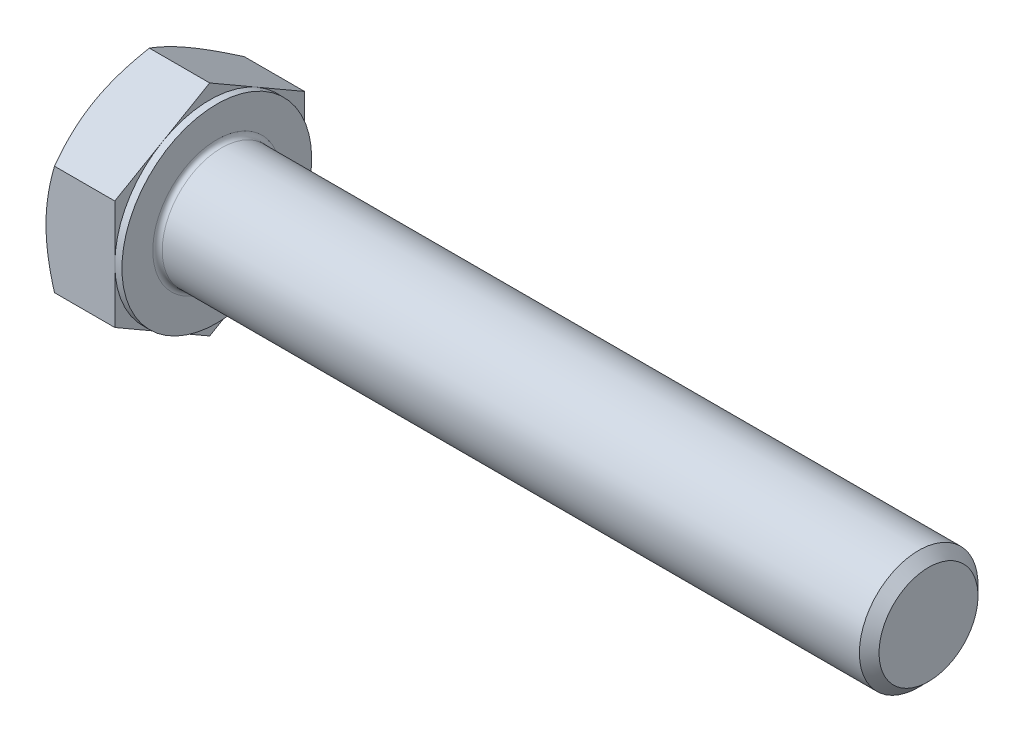
ISO-10303-21;
HEADER;
FILE_DESCRIPTION(('STEP AP214'),'2;1');
FILE_NAME('part.step','',(''),(''),'','','');
FILE_SCHEMA(('AUTOMOTIVE_DESIGN { 1 0 10303 214 1 1 1 1 }'));
ENDSEC;
DATA;
#1=APPLICATION_CONTEXT('core data for automotive mechanical design processes');
#2=APPLICATION_PROTOCOL_DEFINITION('international standard','automotive_design',2000,#1);
#3=PRODUCT_CONTEXT('',#1,'mechanical');
#4=PRODUCT('Part','Part','',(#3));
#5=PRODUCT_RELATED_PRODUCT_CATEGORY('part','',(#4));
#6=PRODUCT_DEFINITION_FORMATION('','',#4);
#7=PRODUCT_DEFINITION_CONTEXT('part definition',#1,'design');
#8=PRODUCT_DEFINITION('design','',#6,#7);
#9=PRODUCT_DEFINITION_SHAPE('','',#8);
#10=(LENGTH_UNIT() NAMED_UNIT(*) SI_UNIT(.MILLI.,.METRE.));
#11=(NAMED_UNIT(*) PLANE_ANGLE_UNIT() SI_UNIT($,.RADIAN.));
#12=(NAMED_UNIT(*) SI_UNIT($,.STERADIAN.) SOLID_ANGLE_UNIT());
#13=UNCERTAINTY_MEASURE_WITH_UNIT(LENGTH_MEASURE(1.E-05),#10,'distance_accuracy_value','');
#14=(GEOMETRIC_REPRESENTATION_CONTEXT(3) GLOBAL_UNCERTAINTY_ASSIGNED_CONTEXT((#13)) GLOBAL_UNIT_ASSIGNED_CONTEXT((#10,
#11,#12)) REPRESENTATION_CONTEXT('',''));
#15=CARTESIAN_POINT('',(0.,0.,0.));
#16=DIRECTION('',(0.,0.,1.));
#17=DIRECTION('',(1.,0.,0.));
#18=AXIS2_PLACEMENT_3D('',#15,#16,#17);
#19=CARTESIAN_POINT('',(6.4,9.23760430703402,0.));
#20=DIRECTION('',(1.,0.,0.));
#21=DIRECTION('',(0.,0.,-1.));
#22=AXIS2_PLACEMENT_3D('',#19,#20,#21);
#23=PLANE('',#22);
#24=CARTESIAN_POINT('',(6.4,0.,0.));
#25=DIRECTION('',(1.,0.,0.));
#26=DIRECTION('',(0.,0.,-1.));
#27=AXIS2_PLACEMENT_3D('',#24,#25,#26);
#28=CIRCLE('',#27,5.4);
#29=CARTESIAN_POINT('',(6.4,0.,-5.4));
#30=VERTEX_POINT('',#29);
#31=EDGE_CURVE('E48',#30,#30,#28,.F.);
#32=ORIENTED_EDGE('',*,*,#31,.T.);
#33=EDGE_LOOP('',(#32));
#34=FACE_BOUND('',#33,.T.);
#35=CARTESIAN_POINT('',(6.4,0.,0.));
#36=DIRECTION('',(1.,0.,0.));
#37=DIRECTION('',(0.,0.,-1.));
#38=AXIS2_PLACEMENT_3D('',#35,#36,#37);
#39=CIRCLE('',#38,8.);
#40=CARTESIAN_POINT('',(6.4,0.,-8.));
#41=VERTEX_POINT('',#40);
#42=EDGE_CURVE('E279',#41,#41,#39,.T.);
#43=ORIENTED_EDGE('',*,*,#42,.T.);
#44=EDGE_LOOP('',(#43));
#45=FACE_BOUND('',#44,.T.);
#46=ADVANCED_FACE('F38',(#34,#45),#23,.T.);
#47=CARTESIAN_POINT('',(0.,0.,0.));
#48=DIRECTION('',(-1.,0.,0.));
#49=DIRECTION('',(0.,0.,1.));
#50=AXIS2_PLACEMENT_3D('',#47,#48,#49);
#51=CYLINDRICAL_SURFACE('',#50,5.);
#52=CARTESIAN_POINT('',(6.8,0.,0.));
#53=DIRECTION('',(1.,0.,0.));
#54=DIRECTION('',(0.,0.,-1.));
#55=AXIS2_PLACEMENT_3D('',#52,#53,#54);
#56=CIRCLE('',#55,5.);
#57=CARTESIAN_POINT('',(6.8,0.,-5.));
#58=VERTEX_POINT('',#57);
#59=EDGE_CURVE('E11',#58,#58,#56,.T.);
#60=ORIENTED_EDGE('',*,*,#59,.T.);
#61=EDGE_LOOP('',(#60));
#62=FACE_BOUND('',#61,.T.);
#63=CARTESIAN_POINT('',(65.572,0.,0.));
#64=DIRECTION('',(-1.,0.,0.));
#65=DIRECTION('',(0.,0.,1.));
#66=AXIS2_PLACEMENT_3D('',#63,#64,#65);
#67=CIRCLE('',#66,5.);
#68=CARTESIAN_POINT('',(65.572,0.,5.));
#69=VERTEX_POINT('',#68);
#70=EDGE_CURVE('E322',#69,#69,#67,.T.);
#71=ORIENTED_EDGE('',*,*,#70,.T.);
#72=EDGE_LOOP('',(#71));
#73=FACE_BOUND('',#72,.T.);
#74=ADVANCED_FACE('F266',(#62,#73),#51,.T.);
#75=CARTESIAN_POINT('',(66.4,0.,0.));
#76=DIRECTION('',(-1.,0.,0.));
#77=DIRECTION('',(0.,0.,1.));
#78=AXIS2_PLACEMENT_3D('',#75,#76,#77);
#79=CONICAL_SURFACE('',#78,4.172,0.785398163397444);
#80=ORIENTED_EDGE('',*,*,#70,.F.);
#81=EDGE_LOOP('',(#80));
#82=FACE_BOUND('',#81,.T.);
#83=CARTESIAN_POINT('',(66.4,0.,0.));
#84=DIRECTION('',(-1.,0.,0.));
#85=DIRECTION('',(0.,0.,1.));
#86=AXIS2_PLACEMENT_3D('',#83,#84,#85);
#87=CIRCLE('',#86,4.172);
#88=CARTESIAN_POINT('',(66.4,0.,4.172));
#89=VERTEX_POINT('',#88);
#90=EDGE_CURVE('E369',#89,#89,#87,.T.);
#91=ORIENTED_EDGE('',*,*,#90,.T.);
#92=EDGE_LOOP('',(#91));
#93=FACE_BOUND('',#92,.T.);
#94=ADVANCED_FACE('F271',(#82,#93),#79,.T.);
#95=CARTESIAN_POINT('',(66.4,0.,0.));
#96=DIRECTION('',(-1.,0.,0.));
#97=DIRECTION('',(0.,0.,1.));
#98=AXIS2_PLACEMENT_3D('',#95,#96,#97);
#99=PLANE('',#98);
#100=ORIENTED_EDGE('',*,*,#90,.F.);
#101=EDGE_LOOP('',(#100));
#102=FACE_BOUND('',#101,.T.);
#103=ADVANCED_FACE('F382',(#102),#99,.F.);
#104=CARTESIAN_POINT('',(5.8,8.,0.));
#105=DIRECTION('',(1.,0.,0.));
#106=DIRECTION('',(0.,0.,-1.));
#107=AXIS2_PLACEMENT_3D('',#104,#105,#106);
#108=PLANE('',#107);
#109=DIRECTION('',(0.,0.500000000000001,0.866025403784438));
#110=VECTOR('',#109,1.);
#111=CARTESIAN_POINT('',(5.8,4.61880215351699,-8.));
#112=LINE('',#111,#110);
#113=CARTESIAN_POINT('',(5.8,4.61880215351699,-8.));
#114=VERTEX_POINT('',#113);
#115=CARTESIAN_POINT('',(5.8,6.9282032302755,-4.00000000000001));
#116=VERTEX_POINT('',#115);
#117=EDGE_CURVE('E181',#114,#116,#112,.T.);
#118=ORIENTED_EDGE('',*,*,#117,.T.);
#119=CARTESIAN_POINT('',(5.8,0.,0.));
#120=DIRECTION('',(-1.,0.,0.));
#121=DIRECTION('',(0.,0.,1.));
#122=AXIS2_PLACEMENT_3D('',#119,#120,#121);
#123=CIRCLE('',#122,8.);
#124=CARTESIAN_POINT('',(5.8,0.,-8.));
#125=VERTEX_POINT('',#124);
#126=EDGE_CURVE('E55',#116,#125,#123,.T.);
#127=ORIENTED_EDGE('',*,*,#126,.T.);
#128=DIRECTION('',(0.,1.,0.));
#129=VECTOR('',#128,1.);
#130=CARTESIAN_POINT('',(5.8,4.61880215351699,-8.));
#131=LINE('',#130,#129);
#132=EDGE_CURVE('E281',#125,#114,#131,.T.);
#133=ORIENTED_EDGE('',*,*,#132,.T.);
#134=EDGE_LOOP('',(#118,#127,#133));
#135=FACE_BOUND('',#134,.T.);
#136=ADVANCED_FACE('F311',(#135),#108,.T.);
#137=CARTESIAN_POINT('',(5.8,9.23760430703402,0.));
#138=VERTEX_POINT('',#137);
#139=EDGE_CURVE('E178',#116,#138,#112,.T.);
#140=ORIENTED_EDGE('',*,*,#139,.T.);
#141=DIRECTION('',(0.,-0.500000000000001,0.866025403784438));
#142=VECTOR('',#141,1.);
#143=CARTESIAN_POINT('',(5.8,9.23760430703402,0.));
#144=LINE('',#143,#142);
#145=CARTESIAN_POINT('',(5.8,6.92820323027551,4.00000000000001));
#146=VERTEX_POINT('',#145);
#147=EDGE_CURVE('E177',#138,#146,#144,.T.);
#148=ORIENTED_EDGE('',*,*,#147,.T.);
#149=EDGE_CURVE('E160',#146,#116,#123,.T.);
#150=ORIENTED_EDGE('',*,*,#149,.T.);
#151=EDGE_LOOP('',(#140,#148,#150));
#152=FACE_BOUND('',#151,.T.);
#153=ADVANCED_FACE('F411',(#152),#108,.T.);
#154=CARTESIAN_POINT('',(5.8,4.618802153517,8.));
#155=VERTEX_POINT('',#154);
#156=EDGE_CURVE('E137',#146,#155,#144,.T.);
#157=ORIENTED_EDGE('',*,*,#156,.T.);
#158=DIRECTION('',(0.,-1.,0.));
#159=VECTOR('',#158,1.);
#160=CARTESIAN_POINT('',(5.8,4.618802153517,8.));
#161=LINE('',#160,#159);
#162=CARTESIAN_POINT('',(5.8,0.,8.));
#163=VERTEX_POINT('',#162);
#164=EDGE_CURVE('E131',#155,#163,#161,.T.);
#165=ORIENTED_EDGE('',*,*,#164,.T.);
#166=EDGE_CURVE('E135',#163,#146,#123,.T.);
#167=ORIENTED_EDGE('',*,*,#166,.T.);
#168=EDGE_LOOP('',(#157,#165,#167));
#169=FACE_BOUND('',#168,.T.);
#170=ADVANCED_FACE('F133',(#169),#108,.T.);
#171=CARTESIAN_POINT('',(5.8,-4.61880215351701,8.));
#172=VERTEX_POINT('',#171);
#173=EDGE_CURVE('E142',#163,#172,#161,.T.);
#174=ORIENTED_EDGE('',*,*,#173,.T.);
#175=DIRECTION('',(0.,-0.500000000000002,-0.866025403784438));
#176=VECTOR('',#175,1.);
#177=CARTESIAN_POINT('',(5.8,-9.23760430703403,0.));
#178=LINE('',#177,#176);
#179=CARTESIAN_POINT('',(5.8,-6.9282032302755,4.00000000000001));
#180=VERTEX_POINT('',#179);
#181=EDGE_CURVE('E149',#172,#180,#178,.T.);
#182=ORIENTED_EDGE('',*,*,#181,.T.);
#183=EDGE_CURVE('E146',#180,#163,#123,.T.);
#184=ORIENTED_EDGE('',*,*,#183,.T.);
#185=EDGE_LOOP('',(#174,#182,#184));
#186=FACE_BOUND('',#185,.T.);
#187=ADVANCED_FACE('F147',(#186),#108,.T.);
#188=CARTESIAN_POINT('',(5.8,-9.23760430703403,0.));
#189=VERTEX_POINT('',#188);
#190=EDGE_CURVE('E171',#180,#189,#178,.T.);
#191=ORIENTED_EDGE('',*,*,#190,.T.);
#192=DIRECTION('',(0.,0.5,-0.866025403784438));
#193=VECTOR('',#192,1.);
#194=CARTESIAN_POINT('',(5.8,-4.61880215351702,-8.));
#195=LINE('',#194,#193);
#196=CARTESIAN_POINT('',(5.8,-6.92820323027551,-4.));
#197=VERTEX_POINT('',#196);
#198=EDGE_CURVE('E330',#189,#197,#195,.T.);
#199=ORIENTED_EDGE('',*,*,#198,.T.);
#200=EDGE_CURVE('E154',#197,#180,#123,.T.);
#201=ORIENTED_EDGE('',*,*,#200,.T.);
#202=EDGE_LOOP('',(#191,#199,#201));
#203=FACE_BOUND('',#202,.T.);
#204=ADVANCED_FACE('F339',(#203),#108,.T.);
#205=CARTESIAN_POINT('',(5.8,-4.61880215351702,-8.));
#206=VERTEX_POINT('',#205);
#207=EDGE_CURVE('E162',#197,#206,#195,.T.);
#208=ORIENTED_EDGE('',*,*,#207,.T.);
#209=EDGE_CURVE('E287',#206,#125,#131,.T.);
#210=ORIENTED_EDGE('',*,*,#209,.T.);
#211=EDGE_CURVE('E304',#125,#197,#123,.T.);
#212=ORIENTED_EDGE('',*,*,#211,.T.);
#213=EDGE_LOOP('',(#208,#210,#212));
#214=FACE_BOUND('',#213,.T.);
#215=ADVANCED_FACE('F303',(#214),#108,.T.);
#216=CARTESIAN_POINT('',(0.,0.,0.));
#217=DIRECTION('',(-1.,0.,0.));
#218=DIRECTION('',(0.,0.,1.));
#219=AXIS2_PLACEMENT_3D('',#216,#217,#218);
#220=CYLINDRICAL_SURFACE('',#219,8.);
#221=ORIENTED_EDGE('',*,*,#126,.F.);
#222=ORIENTED_EDGE('',*,*,#149,.F.);
#223=ORIENTED_EDGE('',*,*,#166,.F.);
#224=ORIENTED_EDGE('',*,*,#183,.F.);
#225=ORIENTED_EDGE('',*,*,#200,.F.);
#226=ORIENTED_EDGE('',*,*,#211,.F.);
#227=EDGE_LOOP('',(#221,#222,#223,#224,#225,#226));
#228=FACE_BOUND('',#227,.T.);
#229=ORIENTED_EDGE('',*,*,#42,.F.);
#230=EDGE_LOOP('',(#229));
#231=FACE_BOUND('',#230,.T.);
#232=ADVANCED_FACE('F157',(#228,#231),#220,.T.);
#233=CARTESIAN_POINT('',(0.,9.23760430703402,0.));
#234=DIRECTION('',(1.,0.,0.));
#235=DIRECTION('',(0.,0.,-1.));
#236=AXIS2_PLACEMENT_3D('',#233,#234,#235);
#237=PLANE('',#236);
#238=CARTESIAN_POINT('',(0.,0.,0.));
#239=DIRECTION('',(1.,0.,0.));
#240=DIRECTION('',(0.,0.,-1.));
#241=AXIS2_PLACEMENT_3D('',#238,#239,#240);
#242=CIRCLE('',#241,8.);
#243=CARTESIAN_POINT('',(0.,0.,-8.));
#244=VERTEX_POINT('',#243);
#245=CARTESIAN_POINT('',(0.,6.9282032302755,-4.00000000000001));
#246=VERTEX_POINT('',#245);
#247=EDGE_CURVE('E282',#244,#246,#242,.T.);
#248=ORIENTED_EDGE('',*,*,#247,.F.);
#249=CARTESIAN_POINT('',(0.,-6.92820323027551,-4.));
#250=VERTEX_POINT('',#249);
#251=EDGE_CURVE('E292',#250,#244,#242,.T.);
#252=ORIENTED_EDGE('',*,*,#251,.F.);
#253=CARTESIAN_POINT('',(0.,-6.9282032302755,4.00000000000001));
#254=VERTEX_POINT('',#253);
#255=EDGE_CURVE('E408',#254,#250,#242,.T.);
#256=ORIENTED_EDGE('',*,*,#255,.F.);
#257=CARTESIAN_POINT('',(0.,0.,8.));
#258=VERTEX_POINT('',#257);
#259=EDGE_CURVE('E366',#258,#254,#242,.T.);
#260=ORIENTED_EDGE('',*,*,#259,.F.);
#261=CARTESIAN_POINT('',(0.,0.,0.));
#262=DIRECTION('',(-1.,0.,0.));
#263=DIRECTION('',(0.,0.,1.));
#264=AXIS2_PLACEMENT_3D('',#261,#262,#263);
#265=CIRCLE('',#264,8.);
#266=CARTESIAN_POINT('',(0.,6.92820323027551,4.00000000000001));
#267=VERTEX_POINT('',#266);
#268=EDGE_CURVE('E182',#258,#267,#265,.T.);
#269=ORIENTED_EDGE('',*,*,#268,.T.);
#270=EDGE_CURVE('E290',#246,#267,#242,.T.);
#271=ORIENTED_EDGE('',*,*,#270,.F.);
#272=EDGE_LOOP('',(#248,#252,#256,#260,#269,#271));
#273=FACE_BOUND('',#272,.T.);
#274=ADVANCED_FACE('F388',(#273),#237,.F.);
#275=CARTESIAN_POINT('',(0.,0.,0.));
#276=DIRECTION('',(1.,0.,0.));
#277=DIRECTION('',(0.,0.,-1.));
#278=AXIS2_PLACEMENT_3D('',#275,#276,#277);
#279=CONICAL_SURFACE('',#278,8.,1.0471975511966);
#280=CARTESIAN_POINT('',(0.714597847732967,4.61868668346316,8.0002));
#281=CARTESIAN_POINT('',(0.655990714047292,4.72021302617289,7.8243512161201));
#282=CARTESIAN_POINT('',(0.600043401047285,4.82211789504564,7.64784680569387));
#283=CARTESIAN_POINT('',(0.494201005024662,5.02675523421805,7.29340453712154));
#284=CARTESIAN_POINT('',(0.444308534431063,5.12948804149869,7.11546609530729));
#285=CARTESIAN_POINT('',(0.304692797206863,5.43933133858026,6.57880176237736));
#286=CARTESIAN_POINT('',(0.225281170978366,5.64766491807817,6.21795741776428));
#287=CARTESIAN_POINT('',(0.132161646294487,5.95943209350317,5.67796082979595));
#288=CARTESIAN_POINT('',(0.105634581029123,6.06193429416807,5.50042181035672));
#289=CARTESIAN_POINT('',(0.0611531748588755,6.26740224104454,5.14454088703981));
#290=CARTESIAN_POINT('',(0.0431980765145798,6.37036794548792,4.96619905550676));
#291=CARTESIAN_POINT('',(0.0163156484918646,6.57647664551585,4.60920831517641));
#292=CARTESIAN_POINT('',(0.0073780735462325,6.67961930623067,4.4305599863905));
#293=CARTESIAN_POINT('',(-0.00127769603487081,6.88599991003618,4.07309829490262));
#294=CARTESIAN_POINT('',(-0.000996175497150669,6.98923785008464,3.89428493746994));
#295=CARTESIAN_POINT('',(0.00814502526877508,7.18224506616975,3.5599866329831));
#296=CARTESIAN_POINT('',(0.015889604367369,7.27202796205376,3.40447809566133));
#297=CARTESIAN_POINT('',(0.0382011348534271,7.45138347289924,3.09382523825949));
#298=CARTESIAN_POINT('',(0.0527685461381461,7.5409560732765,2.93868094344001));
#299=CARTESIAN_POINT('',(0.106360690527534,7.80932710333148,2.47384868410519));
#300=CARTESIAN_POINT('',(0.155268641669142,7.98765049311728,2.16498351281829));
#301=CARTESIAN_POINT('',(0.27753940323431,8.34618890253624,1.54397677123971));
#302=CARTESIAN_POINT('',(0.351420520375996,8.52635816315521,1.23191445788553));
#303=CARTESIAN_POINT('',(0.519100141254967,8.88400987687704,0.612443518305243));
#304=CARTESIAN_POINT('',(0.61285926085445,9.06149691008278,0.30502695910825));
#305=CARTESIAN_POINT('',(0.71459784773297,9.23771977708785,-0.000199999999999668));
#306=B_SPLINE_CURVE_WITH_KNOTS('',3,(#280,#281,#282,#283,#284,#285,#286,#287,#288,#289,#290,
#291,#292,#293,#294,#295,#296,#297,#298,#299,#300,#301,#302,#303,#304,#305),.UNSPECIFIED.,.F.,
.F.,(4,2,2,2,2,2,2,2,2,2,2,2,4),(0.,0.63397354372135,1.26821965714356,2.53934712434765,
3.15934343977049,3.77928496069783,4.39852133866765,5.01773858515595,5.55680239410248,
6.09590254421147,7.17487077411835,8.27776850154293,9.37850115249055),.UNSPECIFIED.);
#307=CARTESIAN_POINT('',(0.71453117981632,9.23760430703402,0.));
#308=VERTEX_POINT('',#307);
#309=EDGE_CURVE('E234',#267,#308,#306,.T.);
#310=ORIENTED_EDGE('',*,*,#309,.T.);
#311=CARTESIAN_POINT('',(0.71459784773297,9.23771977708785,0.0002));
#312=CARTESIAN_POINT('',(0.655990714047296,9.13619343437813,-0.175648783879896));
#313=CARTESIAN_POINT('',(0.600043401047289,9.03428856550538,-0.352153194306135));
#314=CARTESIAN_POINT('',(0.494201005024665,8.82965122633297,-0.70659546287846));
#315=CARTESIAN_POINT('',(0.444308534431065,8.72691841905233,-0.884533904692711));
#316=CARTESIAN_POINT('',(0.304692797206864,8.41707512197076,-1.42119823762264));
#317=CARTESIAN_POINT('',(0.225281170978367,8.20874154247284,-1.78204258223572));
#318=CARTESIAN_POINT('',(0.132161646294488,7.89697436704785,-2.32203917020405));
#319=CARTESIAN_POINT('',(0.105634581029123,7.79447216638294,-2.49957818964328));
#320=CARTESIAN_POINT('',(0.0611531748588745,7.58900421950647,-2.8554591129602));
#321=CARTESIAN_POINT('',(0.0431980765145785,7.4860385150631,-3.03380094449324));
#322=CARTESIAN_POINT('',(0.0163156484918633,7.27992981503517,-3.39079168482359));
#323=CARTESIAN_POINT('',(0.00737807354623154,7.17678715432034,-3.5694400136095));
#324=CARTESIAN_POINT('',(-0.00127769603487235,6.97040655051484,-3.92690170509738));
#325=CARTESIAN_POINT('',(-0.000996175497153107,6.86716861046638,-4.10571506253006));
#326=CARTESIAN_POINT('',(0.00814502526877204,6.67416139438126,-4.4400133670169));
#327=CARTESIAN_POINT('',(0.0158896043673661,6.58437849849726,-4.59552190433867));
#328=CARTESIAN_POINT('',(0.0382011348534242,6.40502298765178,-4.90617476174051));
#329=CARTESIAN_POINT('',(0.052768546138143,6.31545038727451,-5.06131905655999));
#330=CARTESIAN_POINT('',(0.106360690527531,6.04707935721953,-5.52615131589481));
#331=CARTESIAN_POINT('',(0.155268641669138,5.86875596743374,-5.83501648718171));
#332=CARTESIAN_POINT('',(0.277539403234306,5.51021755801477,-6.4560232287603));
#333=CARTESIAN_POINT('',(0.351420520375991,5.3300482973958,-6.76808554211447));
#334=CARTESIAN_POINT('',(0.519100141254961,4.97239658367397,-7.38755648169476));
#335=CARTESIAN_POINT('',(0.612859260854444,4.79490955046824,-7.69497304089175));
#336=CARTESIAN_POINT('',(0.714597847732965,4.61868668346316,-8.0002));
#337=B_SPLINE_CURVE_WITH_KNOTS('',3,(#311,#312,#313,#314,#315,#316,#317,#318,#319,#320,#321,
#322,#323,#324,#325,#326,#327,#328,#329,#330,#331,#332,#333,#334,#335,#336),.UNSPECIFIED.,.F.,
.F.,(4,2,2,2,2,2,2,2,2,2,2,2,4),(0.,0.63397354372135,1.26821965714356,2.53934712434766,
3.15934343977049,3.77928496069784,4.39852133866766,5.01773858515595,5.55680239410249,
6.09590254421148,7.17487077411835,8.27776850154293,9.37850115249055),.UNSPECIFIED.);
#338=EDGE_CURVE('E63',#308,#246,#337,.T.);
#339=ORIENTED_EDGE('',*,*,#338,.T.);
#340=ORIENTED_EDGE('',*,*,#270,.T.);
#341=EDGE_LOOP('',(#310,#339,#340));
#342=FACE_BOUND('',#341,.T.);
#343=ADVANCED_FACE('F390',(#342),#279,.T.);
#344=CARTESIAN_POINT('',(4.02490590955888,-12.6546855843617,7.99999999999999));
#345=CARTESIAN_POINT('',(3.8533848737599,-12.3031246800229,7.99999999999999));
#346=CARTESIAN_POINT('',(3.68343819387199,-11.9507829192251,7.99999999999999));
#347=CARTESIAN_POINT('',(3.34757427772114,-11.2441233293434,7.99999999999999));
#348=CARTESIAN_POINT('',(3.18165763115449,-10.889805220286,7.99999999999999));
#349=CARTESIAN_POINT('',(2.85395194343766,-10.1770689379398,7.99999999999999));
#350=CARTESIAN_POINT('',(2.6921882496399,-9.8186390717221,7.99999999999999));
#351=CARTESIAN_POINT('',(2.37495726740338,-9.09901412811099,7.99999999999999));
#352=CARTESIAN_POINT('',(2.21948969724233,-8.73781917530422,7.99999999999999));
#353=CARTESIAN_POINT('',(1.91124909611306,-7.99950051377995,7.99999999999999));
#354=CARTESIAN_POINT('',(1.75875676572666,-7.62225899058111,7.99999999999999));
#355=CARTESIAN_POINT('',(1.46472411298909,-6.86345576673942,7.99999999999999));
#356=CARTESIAN_POINT('',(1.32318498461756,-6.48189360029688,8.));
#357=CARTESIAN_POINT('',(1.05459432501407,-5.71447512364444,8.));
#358=CARTESIAN_POINT('',(0.927515476081558,-5.32862847439955,8.));
#359=CARTESIAN_POINT('',(0.691757211097742,-4.55141880373957,8.));
#360=CARTESIAN_POINT('',(0.583072254842115,-4.16005748194273,8.));
#361=CARTESIAN_POINT('',(0.38975037684422,-3.3737637827452,8.));
#362=CARTESIAN_POINT('',(0.304973724086276,-2.97886668674349,7.99999999999999));
#363=CARTESIAN_POINT('',(0.19927520023723,-2.38273452840882,8.));
#364=CARTESIAN_POINT('',(0.167618755709461,-2.1833797771194,8.));
#365=CARTESIAN_POINT('',(0.112075358694774,-1.78359737601686,8.));
#366=CARTESIAN_POINT('',(0.0881876500546175,-1.58316983255305,8.));
#367=CARTESIAN_POINT('',(0.0489706977401169,-1.18423542027826,8.));
#368=CARTESIAN_POINT('',(0.0335291730980847,-0.98573963745877,8.));
#369=CARTESIAN_POINT('',(0.0110629716488631,-0.588272086946685,8.));
#370=CARTESIAN_POINT('',(0.00403814825766994,-0.389300327604096,8.));
#371=CARTESIAN_POINT('',(-0.00142584062082165,0.00876221081483254,8.));
#372=CARTESIAN_POINT('',(0.00013495767647439,0.20785298938559,8.));
#373=CARTESIAN_POINT('',(0.0118014217876181,0.605786203078672,8.));
#374=CARTESIAN_POINT('',(0.0219074673810696,0.804628626769908,8.));
#375=CARTESIAN_POINT('',(0.0557165373437138,1.27520491378392,8.));
#376=CARTESIAN_POINT('',(0.083067269524206,1.54668291471763,8.));
#377=CARTESIAN_POINT('',(0.152259238389069,2.08777092307492,8.));
#378=CARTESIAN_POINT('',(0.194102243863654,2.35738069838156,8.));
#379=CARTESIAN_POINT('',(0.339163188799739,3.16301774665639,8.));
#380=CARTESIAN_POINT('',(0.461891294668971,3.69558688173418,8.));
#381=CARTESIAN_POINT('',(0.676586595213055,4.49226053267632,8.));
#382=CARTESIAN_POINT('',(0.754301850106125,4.76044512009595,8.));
#383=CARTESIAN_POINT('',(0.918275616254531,5.29421544036088,8.));
#384=CARTESIAN_POINT('',(1.00453419017724,5.55980115412708,8.));
#385=CARTESIAN_POINT('',(1.18417203245489,6.08844836893932,8.));
#386=CARTESIAN_POINT('',(1.27754931556251,6.35151055086868,8.));
#387=CARTESIAN_POINT('',(1.47027924561322,6.87542420819584,8.));
#388=CARTESIAN_POINT('',(1.56963178297476,7.13627572403553,8.));
#389=CARTESIAN_POINT('',(1.83061788216801,7.80218874880577,8.));
#390=CARTESIAN_POINT('',(1.99585030591403,8.20583800152905,8.));
#391=CARTESIAN_POINT('',(2.33560643435573,9.00922090340249,8.));
#392=CARTESIAN_POINT('',(2.5101309931742,9.40895418858895,8.));
#393=CARTESIAN_POINT('',(2.86641484762337,10.2053302393419,8.));
#394=CARTESIAN_POINT('',(3.04817649203488,10.6019719507727,8.));
#395=CARTESIAN_POINT('',(3.41731474780412,11.3926098653434,8.));
#396=CARTESIAN_POINT('',(3.60469117417195,11.7866061551194,8.));
#397=CARTESIAN_POINT('',(3.98417976786819,12.5730081264134,8.));
#398=CARTESIAN_POINT('',(4.17629837893023,12.9654106921397,8.));
#399=CARTESIAN_POINT('',(4.56413460673705,13.7484335593548,8.));
#400=CARTESIAN_POINT('',(4.75985224746017,14.1390538489476,8.));
#401=CARTESIAN_POINT('',(5.15417790496084,14.91873869301,8.));
#402=CARTESIAN_POINT('',(5.35278537052947,15.3078035265797,8.));
#403=CARTESIAN_POINT('',(5.75241277357112,16.0846929446673,8.));
#404=CARTESIAN_POINT('',(5.95343272118929,16.4725175239607,8.00000000000001));
#405=CARTESIAN_POINT('',(6.52023157707929,17.5591699504467,8.00000000000001));
#406=CARTESIAN_POINT('',(6.88826669162656,18.2568207923885,8.00000000000001));
#407=CARTESIAN_POINT('',(7.62911645716783,19.6496204420456,8.00000000000001));
#408=CARTESIAN_POINT('',(8.00193135552972,20.3447691178627,8.00000000000001));
#409=CARTESIAN_POINT('',(8.74998840178777,21.730949342628,8.00000000000001));
#410=CARTESIAN_POINT('',(9.12521929790285,22.4219869677796,8.00000000000001));
#411=CARTESIAN_POINT('',(9.69012625678299,23.4573861735835,8.00000000000001));
#412=CARTESIAN_POINT('',(9.87876537279042,23.8023143161837,8.00000000000001));
#413=CARTESIAN_POINT('',(10.2566598278907,24.4918321964472,8.00000000000001));
#414=CARTESIAN_POINT('',(10.4459151660087,24.8364219346447,8.00000000000001));
#415=CARTESIAN_POINT('',(10.635441440782,25.1808626322183,8.00000000000001));
#416=B_SPLINE_CURVE_WITH_KNOTS('',3,(#344,#345,#346,#347,#348,#349,#350,#351,#352,#353,#354,
#355,#356,#357,#358,#359,#360,#361,#362,#363,#364,#365,#366,#367,#368,#369,#370,#371,#372,#373,
#374,#375,#376,#377,#378,#379,#380,#381,#382,#383,#384,#385,#386,#387,#388,#389,#390,#391,#392,
#393,#394,#395,#396,#397,#398,#399,#400,#401,#402,#403,#404,#405,#406,#407,#408,#409,#410,#411,
#412,#413,#414,#415),.UNSPECIFIED.,.F.,.F.,(4,2,2,2,2,2,2,2,2,2,2,2,2,2,2,2,2,2,2,2,2,2,2,2,2,2,
2,2,2,2,2,2,2,2,2,4),(0.,1.17352534285519,2.34722138025917,3.52689945010167,4.70652467637677,
5.92708317141315,7.14777452944079,8.36612012171132,9.58409809506408,10.7948027119676,
11.4002329189197,12.0056041799731,12.6027191107726,13.199823642157,13.7969256548693,
14.3940542062034,15.2121538291978,16.0303533369241,17.6675489652002,18.5051258655031,
19.3427089100958,20.1800592201862,21.0173941785985,22.3257038346386,23.6341339573728,
24.9429922461244,26.2518074593073,27.5625113626671,28.8732240016859,30.1836898283921,
31.4941611678941,33.8604585893124,36.2268789719357,38.5858914350282,39.7653150976312,
40.9447368953005),.UNSPECIFIED.);
#417=CARTESIAN_POINT('',(0.714531179816316,4.618802153517,8.));
#418=VERTEX_POINT('',#417);
#419=EDGE_CURVE('E248',#258,#418,#416,.T.);
#420=ORIENTED_EDGE('',*,*,#419,.T.);
#421=EDGE_CURVE('E247',#418,#267,#306,.T.);
#422=ORIENTED_EDGE('',*,*,#421,.T.);
#423=ORIENTED_EDGE('',*,*,#268,.F.);
#424=EDGE_LOOP('',(#420,#422,#423));
#425=FACE_BOUND('',#424,.T.);
#426=ADVANCED_FACE('F357',(#425),#279,.T.);
#427=CARTESIAN_POINT('',(0.714531179816316,-4.61880215351701,8.));
#428=VERTEX_POINT('',#427);
#429=EDGE_CURVE('E359',#428,#258,#416,.T.);
#430=ORIENTED_EDGE('',*,*,#429,.T.);
#431=ORIENTED_EDGE('',*,*,#259,.T.);
#432=CARTESIAN_POINT('',(0.714597847732981,-9.23771977708787,-0.000199999999999317));
#433=CARTESIAN_POINT('',(0.655990714047306,-9.13619343437814,0.175648783879897));
#434=CARTESIAN_POINT('',(0.600043401047299,-9.0342885655054,0.352153194306136));
#435=CARTESIAN_POINT('',(0.494201005024674,-8.82965122633298,0.70659546287846));
#436=CARTESIAN_POINT('',(0.444308534431074,-8.72691841905234,0.884533904692713));
#437=CARTESIAN_POINT('',(0.304692797206873,-8.41707512197077,1.42119823762264));
#438=CARTESIAN_POINT('',(0.225281170978376,-8.20874154247286,1.78204258223573));
#439=CARTESIAN_POINT('',(0.132161646294496,-7.89697436704786,2.32203917020405));
#440=CARTESIAN_POINT('',(0.105634581029131,-7.79447216638296,2.49957818964329));
#441=CARTESIAN_POINT('',(0.0611531748588822,-7.58900421950648,2.8554591129602));
#442=CARTESIAN_POINT('',(0.0431980765145868,-7.48603851506311,3.03380094449324));
#443=CARTESIAN_POINT('',(0.0163156484918718,-7.27992981503518,3.3907916848236));
#444=CARTESIAN_POINT('',(0.00737807354623957,-7.17678715432036,3.5694400136095));
#445=CARTESIAN_POINT('',(-0.00127769603486461,-6.97040655051485,3.92690170509739));
#446=CARTESIAN_POINT('',(-0.000996175497145178,-6.86716861046639,4.10571506253007));
#447=CARTESIAN_POINT('',(0.00814502526878012,-6.67416139438127,4.44001336701691));
#448=CARTESIAN_POINT('',(0.0158896043673741,-6.58437849849727,4.59552190433867));
#449=CARTESIAN_POINT('',(0.0382011348534318,-6.40502298765179,4.90617476174051));
#450=CARTESIAN_POINT('',(0.05276854613815,-6.31545038727452,5.06131905656));
#451=CARTESIAN_POINT('',(0.106360690527537,-6.04707935721954,5.52615131589482));
#452=CARTESIAN_POINT('',(0.155268641669145,-5.86875596743375,5.83501648718172));
#453=CARTESIAN_POINT('',(0.277539403234312,-5.51021755801478,6.4560232287603));
#454=CARTESIAN_POINT('',(0.351420520375996,-5.33004829739581,6.76808554211448));
#455=CARTESIAN_POINT('',(0.519100141254965,-4.97239658367398,7.38755648169476));
#456=CARTESIAN_POINT('',(0.612859260854447,-4.79490955046825,7.69497304089175));
#457=CARTESIAN_POINT('',(0.714597847732967,-4.61868668346317,8.0002));
#458=B_SPLINE_CURVE_WITH_KNOTS('',3,(#432,#433,#434,#435,#436,#437,#438,#439,#440,#441,#442,
#443,#444,#445,#446,#447,#448,#449,#450,#451,#452,#453,#454,#455,#456,#457),.UNSPECIFIED.,.F.,
.F.,(4,2,2,2,2,2,2,2,2,2,2,2,4),(0.,0.633973543721351,1.26821965714356,2.53934712434766,
3.15934343977049,3.77928496069784,4.39852133866766,5.01773858515596,5.55680239410249,
6.09590254421148,7.17487077411835,8.27776850154293,9.37850115249055),.UNSPECIFIED.);
#459=EDGE_CURVE('E236',#254,#428,#458,.T.);
#460=ORIENTED_EDGE('',*,*,#459,.T.);
#461=EDGE_LOOP('',(#430,#431,#460));
#462=FACE_BOUND('',#461,.T.);
#463=ADVANCED_FACE('F204',(#462),#279,.T.);
#464=CARTESIAN_POINT('',(0.714531179816329,-9.23760430703403,0.));
#465=VERTEX_POINT('',#464);
#466=EDGE_CURVE('E227',#465,#254,#458,.T.);
#467=ORIENTED_EDGE('',*,*,#466,.T.);
#468=ORIENTED_EDGE('',*,*,#255,.T.);
#469=CARTESIAN_POINT('',(0.714597847732974,-4.61868668346318,-8.0002));
#470=CARTESIAN_POINT('',(0.655990714047299,-4.72021302617291,-7.82435121612011));
#471=CARTESIAN_POINT('',(0.600043401047292,-4.82211789504566,-7.64784680569387));
#472=CARTESIAN_POINT('',(0.494201005024669,-5.02675523421807,-7.29340453712154));
#473=CARTESIAN_POINT('',(0.44430853443107,-5.12948804149871,-7.11546609530729));
#474=CARTESIAN_POINT('',(0.304692797206871,-5.43933133858028,-6.57880176237736));
#475=CARTESIAN_POINT('',(0.225281170978374,-5.64766491807819,-6.21795741776428));
#476=CARTESIAN_POINT('',(0.132161646294495,-5.95943209350319,-5.67796082979595));
#477=CARTESIAN_POINT('',(0.105634581029131,-6.06193429416809,-5.50042181035672));
#478=CARTESIAN_POINT('',(0.0611531748588832,-6.26740224104457,-5.1445408870398));
#479=CARTESIAN_POINT('',(0.0431980765145875,-6.37036794548794,-4.96619905550676));
#480=CARTESIAN_POINT('',(0.0163156484918731,-6.57647664551587,-4.60920831517641));
#481=CARTESIAN_POINT('',(0.00737807354624189,-6.67961930623069,-4.4305599863905));
#482=CARTESIAN_POINT('',(-0.00127769603486067,-6.8859999100362,-4.07309829490262));
#483=CARTESIAN_POINT('',(-0.000996175497140609,-6.98923785008466,-3.89428493746993));
#484=CARTESIAN_POINT('',(0.00814502526878505,-7.18224506616977,-3.5599866329831));
#485=CARTESIAN_POINT('',(0.0158896043673789,-7.27202796205378,-3.40447809566133));
#486=CARTESIAN_POINT('',(0.0382011348534374,-7.45138347289926,-3.09382523825949));
#487=CARTESIAN_POINT('',(0.0527685461381567,-7.54095607327652,-2.93868094344));
#488=CARTESIAN_POINT('',(0.106360690527545,-7.8093271033315,-2.47384868410518));
#489=CARTESIAN_POINT('',(0.155268641669152,-7.9876504931173,-2.16498351281828));
#490=CARTESIAN_POINT('',(0.277539403234321,-8.34618890253626,-1.5439767712397));
#491=CARTESIAN_POINT('',(0.351420520376006,-8.52635816315523,-1.23191445788552));
#492=CARTESIAN_POINT('',(0.519100141254978,-8.88400987687706,-0.612443518305241));
#493=CARTESIAN_POINT('',(0.612859260854461,-9.06149691008279,-0.305026959108249));
#494=CARTESIAN_POINT('',(0.71459784773298,-9.23771977708787,0.000200000000000716));
#495=B_SPLINE_CURVE_WITH_KNOTS('',3,(#469,#470,#471,#472,#473,#474,#475,#476,#477,#478,#479,
#480,#481,#482,#483,#484,#485,#486,#487,#488,#489,#490,#491,#492,#493,#494),.UNSPECIFIED.,.F.,
.F.,(4,2,2,2,2,2,2,2,2,2,2,2,4),(0.,0.633973543721351,1.26821965714356,2.53934712434766,
3.15934343977049,3.77928496069784,4.39852133866766,5.01773858515595,5.55680239410249,
6.09590254421148,7.17487077411835,8.27776850154293,9.37850115249055),.UNSPECIFIED.);
#496=EDGE_CURVE('E235',#250,#465,#495,.T.);
#497=ORIENTED_EDGE('',*,*,#496,.T.);
#498=EDGE_LOOP('',(#467,#468,#497));
#499=FACE_BOUND('',#498,.T.);
#500=ADVANCED_FACE('F396',(#499),#279,.T.);
#501=CARTESIAN_POINT('',(0.714531179816313,4.61880215351699,-8.));
#502=VERTEX_POINT('',#501);
#503=EDGE_CURVE('E237',#246,#502,#337,.T.);
#504=ORIENTED_EDGE('',*,*,#503,.T.);
#505=CARTESIAN_POINT('',(4.02490591677327,-12.654685599145,-8.));
#506=CARTESIAN_POINT('',(3.8533848806743,-12.3031246943085,-8.));
#507=CARTESIAN_POINT('',(3.68343820048657,-11.9507829330126,-8.));
#508=CARTESIAN_POINT('',(3.34757428373752,-11.2441233421334,-8.));
#509=CARTESIAN_POINT('',(3.18165763687249,-10.8898052325765,-8.));
#510=CARTESIAN_POINT('',(2.85395194855878,-10.177068949224,-8.));
#511=CARTESIAN_POINT('',(2.69218825446257,-9.81863908249932,-8.));
#512=CARTESIAN_POINT('',(2.37495727163403,-9.09901413787102,-8.));
#513=CARTESIAN_POINT('',(2.21948970117939,-8.73781918455397,-8.));
#514=CARTESIAN_POINT('',(1.91124909945299,-7.99950052196693,-8.));
#515=CARTESIAN_POINT('',(1.75875676876377,-7.62225899821523,-8.));
#516=CARTESIAN_POINT('',(1.46472411543646,-6.86345577325908,-8.));
#517=CARTESIAN_POINT('',(1.32318498677801,-6.48189360625494,-8.));
#518=CARTESIAN_POINT('',(1.0545943266276,-5.71447512846895,-8.));
#519=CARTESIAN_POINT('',(0.92751547743501,-5.32862847865214,-8.));
#520=CARTESIAN_POINT('',(0.691757211972647,-4.55141880683299,-8.));
#521=CARTESIAN_POINT('',(0.583072255498522,-4.1600574844489,-8.));
#522=CARTESIAN_POINT('',(0.389750377059009,-3.37376378378106,-8.));
#523=CARTESIAN_POINT('',(0.30497372409415,-2.97886668689223,-8.));
#524=CARTESIAN_POINT('',(0.19927520003407,-2.38273452721078,-8.));
#525=CARTESIAN_POINT('',(0.167618755452533,-2.1833797754699,-8.));
#526=CARTESIAN_POINT('',(0.112075358367339,-1.78359737346044,-8.));
#527=CARTESIAN_POINT('',(0.0881876497104365,-1.58316982954116,-8.));
#528=CARTESIAN_POINT('',(0.0489706974028754,-1.18423541636503,-8.));
#529=CARTESIAN_POINT('',(0.0335291727837703,-0.985739633099708,-8.));
#530=CARTESIAN_POINT('',(0.0110629714200289,-0.588272081696592,-8.));
#531=CARTESIAN_POINT('',(0.00403814809138827,-0.389300321908802,-8.));
#532=CARTESIAN_POINT('',(-0.0014258406230809,0.00876221739737291,-8.));
#533=CARTESIAN_POINT('',(0.00013495777569058,0.207852996410176,-8.));
#534=CARTESIAN_POINT('',(0.011801422126109,0.605786210981713,-8.));
#535=CARTESIAN_POINT('',(0.0219074678573634,0.804628635109359,-8.));
#536=CARTESIAN_POINT('',(0.055716538158749,1.27520492278815,-8.));
#537=CARTESIAN_POINT('',(0.083067270533562,1.54668292394838,-8.));
#538=CARTESIAN_POINT('',(0.152259239797329,2.08777093274817,-8.));
#539=CARTESIAN_POINT('',(0.194102245476499,2.35738070827079,-8.));
#540=CARTESIAN_POINT('',(0.339163191030428,3.16301775718138,-8.));
#541=CARTESIAN_POINT('',(0.461891297316743,3.69558689266571,-8.));
#542=CARTESIAN_POINT('',(0.676586598475547,4.4922605442156,-8.));
#543=CARTESIAN_POINT('',(0.75430185357481,4.7604451318422,-8.));
#544=CARTESIAN_POINT('',(0.918275620129026,5.29421545251861,-8.));
#545=CARTESIAN_POINT('',(1.00453419425135,5.55980116648932,-8.));
#546=CARTESIAN_POINT('',(1.1841720369208,6.08844838170899,-8.));
#547=CARTESIAN_POINT('',(1.27754932022059,6.35151056384126,-8.));
#548=CARTESIAN_POINT('',(1.47027925064867,6.87542422157427,-8.));
#549=CARTESIAN_POINT('',(1.56963178819541,7.13627573761688,-8.));
#550=CARTESIAN_POINT('',(1.83061788769923,7.80218876251031,-8.));
#551=CARTESIAN_POINT('',(1.99585031155407,8.2058380151589,-8.));
#552=CARTESIAN_POINT('',(2.33560644018457,9.00922091689224,-8.));
#553=CARTESIAN_POINT('',(2.51013099908301,9.40895420201328,-8.));
#554=CARTESIAN_POINT('',(2.86641485367069,10.2053302526422,-8.));
#555=CARTESIAN_POINT('',(3.0481764981407,10.6019719640146,-8.));
#556=CARTESIAN_POINT('',(3.41731475401142,11.3926098784746,-8.));
#557=CARTESIAN_POINT('',(3.60469118042221,11.7866061681984,-8.));
#558=CARTESIAN_POINT('',(3.98417977419135,12.5730081393898,-8.));
#559=CARTESIAN_POINT('',(4.17629838528327,12.9654107050659,-8.));
#560=CARTESIAN_POINT('',(4.56413461314096,13.7484335721844,-8.));
#561=CARTESIAN_POINT('',(4.75985225388507,14.1390538617309,-8.));
#562=CARTESIAN_POINT('',(5.15417791142115,14.9187387057042,-8.));
#563=CARTESIAN_POINT('',(5.35278537700419,15.3078035392312,-8.));
#564=CARTESIAN_POINT('',(5.75241278006939,16.0846929572359,-8.));
#565=CARTESIAN_POINT('',(5.95343272769668,16.4725175364891,-8.));
#566=CARTESIAN_POINT('',(6.52023158363776,17.559169962925,-8.));
#567=CARTESIAN_POINT('',(6.88826669822287,18.2568208048589,-8.));
#568=CARTESIAN_POINT('',(7.62911646383152,19.6496204545043,-8.));
#569=CARTESIAN_POINT('',(8.00193136222293,20.3447691303174,-8.));
#570=CARTESIAN_POINT('',(8.74998840854042,21.7309493550892,-8.));
#571=CARTESIAN_POINT('',(9.12521930468549,22.4219869802513,-8.));
#572=CARTESIAN_POINT('',(9.69012626360773,23.4573861860725,-8.));
#573=CARTESIAN_POINT('',(9.87876537962874,23.8023143286788,-8.));
#574=CARTESIAN_POINT('',(10.2566598347553,24.491832208955,-8.));
#575=CARTESIAN_POINT('',(10.4459151728861,24.8364219471591,-8.));
#576=CARTESIAN_POINT('',(10.6354414476717,25.1808626447394,-8.));
#577=B_SPLINE_CURVE_WITH_KNOTS('',3,(#505,#506,#507,#508,#509,#510,#511,#512,#513,#514,#515,
#516,#517,#518,#519,#520,#521,#522,#523,#524,#525,#526,#527,#528,#529,#530,#531,#532,#533,#534,
#535,#536,#537,#538,#539,#540,#541,#542,#543,#544,#545,#546,#547,#548,#549,#550,#551,#552,#553,
#554,#555,#556,#557,#558,#559,#560,#561,#562,#563,#564,#565,#566,#567,#568,#569,#570,#571,#572,
#573,#574,#575,#576),.UNSPECIFIED.,.F.,.F.,(4,2,2,2,2,2,2,2,2,2,2,2,2,2,2,2,2,2,2,2,2,2,2,2,2,2,
2,2,2,2,2,2,2,2,2,4),(0.,1.17352534459167,2.34722138373236,3.52689945532928,4.70652468335868,
5.92708318027306,7.14777454017932,8.36612013432257,9.5840981095466,10.7948027291759,
11.40023293749,12.0056041999049,12.6027191320313,13.1998236647426,13.7969256787822,
14.3940542314437,15.2121538551722,16.0303533636327,17.6675489933806,18.5051258944524,
19.3427089398139,20.180059250671,21.0173942098502,22.3257038658076,23.6341339884585,
24.9429922771239,26.2518074902209,27.5625113934848,28.8732240324076,30.1836898590194,
31.4941611984269,33.8604586198774,36.2268790025322,38.5858914656951,39.7653151283338,
40.9447369260388),.UNSPECIFIED.);
#578=EDGE_CURVE('E196',#502,#244,#577,.F.);
#579=ORIENTED_EDGE('',*,*,#578,.T.);
#580=ORIENTED_EDGE('',*,*,#247,.T.);
#581=EDGE_LOOP('',(#504,#579,#580));
#582=FACE_BOUND('',#581,.T.);
#583=ADVANCED_FACE('F409',(#582),#279,.T.);
#584=CARTESIAN_POINT('',(0.714531179816158,-4.61880215351727,-8.));
#585=VERTEX_POINT('',#584);
#586=EDGE_CURVE('E197',#585,#250,#495,.T.);
#587=ORIENTED_EDGE('',*,*,#586,.T.);
#588=ORIENTED_EDGE('',*,*,#251,.T.);
#589=EDGE_CURVE('E186',#244,#585,#577,.F.);
#590=ORIENTED_EDGE('',*,*,#589,.T.);
#591=EDGE_LOOP('',(#587,#588,#590));
#592=FACE_BOUND('',#591,.T.);
#593=ADVANCED_FACE('F213',(#592),#279,.T.);
#594=CARTESIAN_POINT('',(6.4,4.61880215351699,-8.));
#595=DIRECTION('',(0.,0.,1.));
#596=DIRECTION('',(0.,-1.,0.));
#597=AXIS2_PLACEMENT_3D('',#594,#595,#596);
#598=PLANE('',#597);
#599=ORIENTED_EDGE('',*,*,#209,.F.);
#600=DIRECTION('',(-1.,0.,0.));
#601=VECTOR('',#600,1.);
#602=CARTESIAN_POINT('',(6.4,-4.61880215351702,-8.));
#603=LINE('',#602,#601);
#604=EDGE_CURVE('E321',#206,#585,#603,.T.);
#605=ORIENTED_EDGE('',*,*,#604,.T.);
#606=ORIENTED_EDGE('',*,*,#589,.F.);
#607=ORIENTED_EDGE('',*,*,#578,.F.);
#608=DIRECTION('',(-1.,0.,0.));
#609=VECTOR('',#608,1.);
#610=CARTESIAN_POINT('',(6.4,4.61880215351699,-8.));
#611=LINE('',#610,#609);
#612=EDGE_CURVE('E309',#114,#502,#611,.T.);
#613=ORIENTED_EDGE('',*,*,#612,.F.);
#614=ORIENTED_EDGE('',*,*,#132,.F.);
#615=EDGE_LOOP('',(#599,#605,#606,#607,#613,#614));
#616=FACE_BOUND('',#615,.T.);
#617=ADVANCED_FACE('F208',(#616),#598,.F.);
#618=CARTESIAN_POINT('',(6.4,-4.61880215351702,-8.));
#619=DIRECTION('',(0.,0.866025403784438,0.5));
#620=DIRECTION('',(0.,-0.5,0.866025403784438));
#621=AXIS2_PLACEMENT_3D('',#618,#619,#620);
#622=PLANE('',#621);
#623=ORIENTED_EDGE('',*,*,#198,.F.);
#624=DIRECTION('',(-1.,0.,0.));
#625=VECTOR('',#624,1.);
#626=CARTESIAN_POINT('',(6.4,-9.23760430703403,0.));
#627=LINE('',#626,#625);
#628=EDGE_CURVE('E342',#189,#465,#627,.T.);
#629=ORIENTED_EDGE('',*,*,#628,.T.);
#630=ORIENTED_EDGE('',*,*,#496,.F.);
#631=ORIENTED_EDGE('',*,*,#586,.F.);
#632=ORIENTED_EDGE('',*,*,#604,.F.);
#633=ORIENTED_EDGE('',*,*,#207,.F.);
#634=EDGE_LOOP('',(#623,#629,#630,#631,#632,#633));
#635=FACE_BOUND('',#634,.T.);
#636=ADVANCED_FACE('F212',(#635),#622,.F.);
#637=CARTESIAN_POINT('',(6.4,-9.23760430703403,0.));
#638=DIRECTION('',(0.,0.866025403784438,-0.500000000000002));
#639=DIRECTION('',(0.,0.500000000000002,0.866025403784438));
#640=AXIS2_PLACEMENT_3D('',#637,#638,#639);
#641=PLANE('',#640);
#642=ORIENTED_EDGE('',*,*,#181,.F.);
#643=DIRECTION('',(-1.,0.,0.));
#644=VECTOR('',#643,1.);
#645=CARTESIAN_POINT('',(6.4,-4.61880215351701,8.));
#646=LINE('',#645,#644);
#647=EDGE_CURVE('E166',#172,#428,#646,.T.);
#648=ORIENTED_EDGE('',*,*,#647,.T.);
#649=ORIENTED_EDGE('',*,*,#459,.F.);
#650=ORIENTED_EDGE('',*,*,#466,.F.);
#651=ORIENTED_EDGE('',*,*,#628,.F.);
#652=ORIENTED_EDGE('',*,*,#190,.F.);
#653=EDGE_LOOP('',(#642,#648,#649,#650,#651,#652));
#654=FACE_BOUND('',#653,.T.);
#655=ADVANCED_FACE('F219',(#654),#641,.F.);
#656=CARTESIAN_POINT('',(6.4,4.618802153517,8.));
#657=DIRECTION('',(0.,0.,-1.));
#658=DIRECTION('',(0.,1.,0.));
#659=AXIS2_PLACEMENT_3D('',#656,#657,#658);
#660=PLANE('',#659);
#661=ORIENTED_EDGE('',*,*,#164,.F.);
#662=DIRECTION('',(-1.,0.,0.));
#663=VECTOR('',#662,1.);
#664=CARTESIAN_POINT('',(6.4,4.618802153517,8.));
#665=LINE('',#664,#663);
#666=EDGE_CURVE('E325',#155,#418,#665,.T.);
#667=ORIENTED_EDGE('',*,*,#666,.T.);
#668=ORIENTED_EDGE('',*,*,#419,.F.);
#669=ORIENTED_EDGE('',*,*,#429,.F.);
#670=ORIENTED_EDGE('',*,*,#647,.F.);
#671=ORIENTED_EDGE('',*,*,#173,.F.);
#672=EDGE_LOOP('',(#661,#667,#668,#669,#670,#671));
#673=FACE_BOUND('',#672,.T.);
#674=ADVANCED_FACE('F164',(#673),#660,.F.);
#675=CARTESIAN_POINT('',(6.4,9.23760430703402,0.));
#676=DIRECTION('',(0.,-0.866025403784438,-0.500000000000001));
#677=DIRECTION('',(0.,0.500000000000001,-0.866025403784438));
#678=AXIS2_PLACEMENT_3D('',#675,#676,#677);
#679=PLANE('',#678);
#680=ORIENTED_EDGE('',*,*,#147,.F.);
#681=DIRECTION('',(-1.,0.,0.));
#682=VECTOR('',#681,1.);
#683=CARTESIAN_POINT('',(6.4,9.23760430703402,0.));
#684=LINE('',#683,#682);
#685=EDGE_CURVE('E324',#138,#308,#684,.T.);
#686=ORIENTED_EDGE('',*,*,#685,.T.);
#687=ORIENTED_EDGE('',*,*,#309,.F.);
#688=ORIENTED_EDGE('',*,*,#421,.F.);
#689=ORIENTED_EDGE('',*,*,#666,.F.);
#690=ORIENTED_EDGE('',*,*,#156,.F.);
#691=EDGE_LOOP('',(#680,#686,#687,#688,#689,#690));
#692=FACE_BOUND('',#691,.T.);
#693=ADVANCED_FACE('F254',(#692),#679,.F.);
#694=CARTESIAN_POINT('',(6.4,4.61880215351699,-8.));
#695=DIRECTION('',(0.,-0.866025403784438,0.500000000000001));
#696=DIRECTION('',(0.,-0.500000000000001,-0.866025403784438));
#697=AXIS2_PLACEMENT_3D('',#694,#695,#696);
#698=PLANE('',#697);
#699=ORIENTED_EDGE('',*,*,#117,.F.);
#700=ORIENTED_EDGE('',*,*,#612,.T.);
#701=ORIENTED_EDGE('',*,*,#503,.F.);
#702=ORIENTED_EDGE('',*,*,#338,.F.);
#703=ORIENTED_EDGE('',*,*,#685,.F.);
#704=ORIENTED_EDGE('',*,*,#139,.F.);
#705=EDGE_LOOP('',(#699,#700,#701,#702,#703,#704));
#706=FACE_BOUND('',#705,.T.);
#707=ADVANCED_FACE('F40',(#706),#698,.F.);
#708=CARTESIAN_POINT('',(6.8,0.,0.));
#709=DIRECTION('',(1.,0.,0.));
#710=DIRECTION('',(0.,0.,-1.));
#711=AXIS2_PLACEMENT_3D('',#708,#709,#710);
#712=TOROIDAL_SURFACE('',#711,5.4,0.4);
#713=ORIENTED_EDGE('',*,*,#59,.F.);
#714=EDGE_LOOP('',(#713));
#715=FACE_BOUND('',#714,.T.);
#716=ORIENTED_EDGE('',*,*,#31,.F.);
#717=EDGE_LOOP('',(#716));
#718=FACE_BOUND('',#717,.T.);
#719=ADVANCED_FACE('F262',(#715,#718),#712,.F.);
#720=CLOSED_SHELL('',(#46,#74,#94,#103,#136,#153,#170,#187,#204,#215,#232,#274,#343,#426,#463,
#500,#583,#593,#617,#636,#655,#674,#693,#707,#719));
#721=MANIFOLD_SOLID_BREP('B2',#720);
#722=ADVANCED_BREP_SHAPE_REPRESENTATION('',(#18,#721),#14);
#723=SHAPE_DEFINITION_REPRESENTATION(#9,#722);
ENDSEC;
END-ISO-10303-21;
